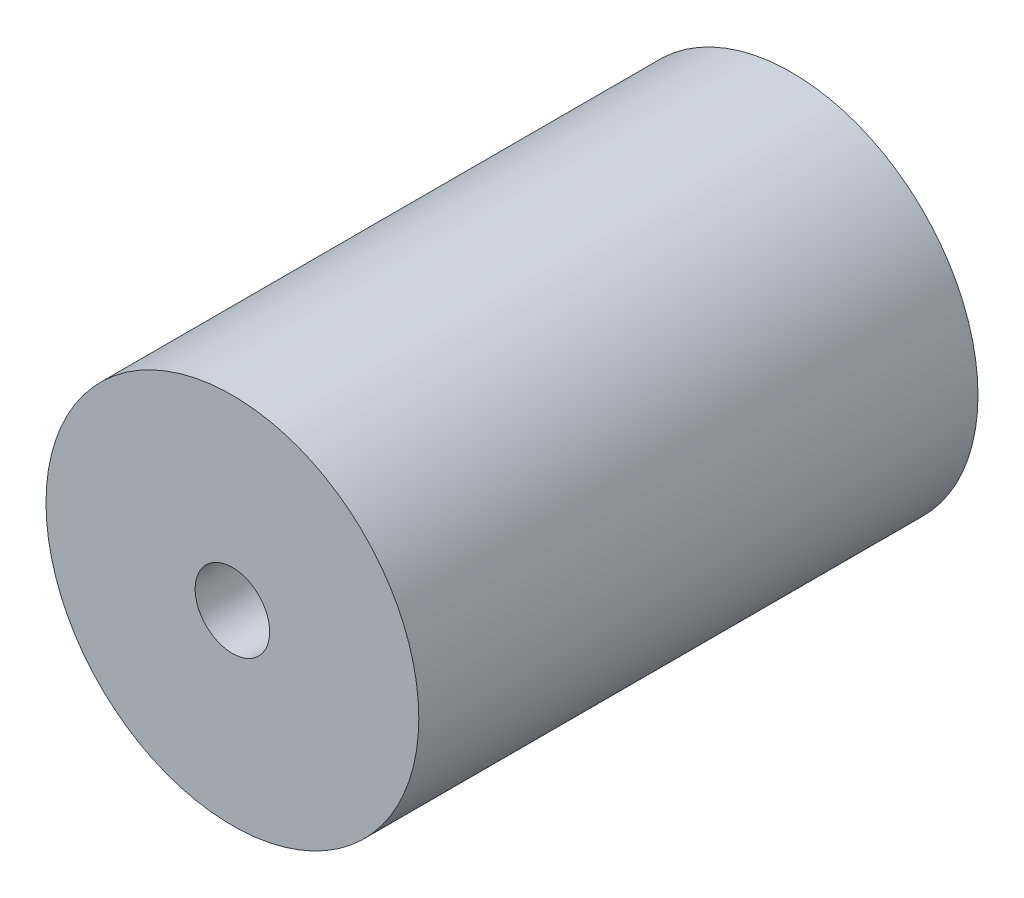
ISO-10303-21;
HEADER;
FILE_DESCRIPTION(('STEP AP214'),'2;1');
FILE_NAME('part.step','',(''),(''),'','','');
FILE_SCHEMA(('AUTOMOTIVE_DESIGN { 1 0 10303 214 1 1 1 1 }'));
ENDSEC;
DATA;
#1=APPLICATION_CONTEXT('core data for automotive mechanical design processes');
#2=APPLICATION_PROTOCOL_DEFINITION('international standard','automotive_design',2000,#1);
#3=PRODUCT_CONTEXT('',#1,'mechanical');
#4=PRODUCT('Part','Part','',(#3));
#5=PRODUCT_RELATED_PRODUCT_CATEGORY('part','',(#4));
#6=PRODUCT_DEFINITION_FORMATION('','',#4);
#7=PRODUCT_DEFINITION_CONTEXT('part definition',#1,'design');
#8=PRODUCT_DEFINITION('design','',#6,#7);
#9=PRODUCT_DEFINITION_SHAPE('','',#8);
#10=(LENGTH_UNIT() NAMED_UNIT(*) SI_UNIT(.MILLI.,.METRE.));
#11=(NAMED_UNIT(*) PLANE_ANGLE_UNIT() SI_UNIT($,.RADIAN.));
#12=(NAMED_UNIT(*) SI_UNIT($,.STERADIAN.) SOLID_ANGLE_UNIT());
#13=UNCERTAINTY_MEASURE_WITH_UNIT(LENGTH_MEASURE(1.E-05),#10,'distance_accuracy_value','');
#14=(GEOMETRIC_REPRESENTATION_CONTEXT(3) GLOBAL_UNCERTAINTY_ASSIGNED_CONTEXT((#13)) GLOBAL_UNIT_ASSIGNED_CONTEXT((#10,
#11,#12)) REPRESENTATION_CONTEXT('',''));
#15=CARTESIAN_POINT('',(0.,0.,0.));
#16=DIRECTION('',(0.,0.,1.));
#17=DIRECTION('',(1.,0.,0.));
#18=AXIS2_PLACEMENT_3D('',#15,#16,#17);
#19=CARTESIAN_POINT('',(0.,0.,-5.86898628384835));
#20=DIRECTION('',(0.,0.,1.));
#21=DIRECTION('',(1.,0.,0.));
#22=AXIS2_PLACEMENT_3D('',#19,#20,#21);
#23=CYLINDRICAL_SURFACE('',#22,2.075);
#24=CARTESIAN_POINT('',(0.,0.,24.5));
#25=DIRECTION('',(0.,0.,1.));
#26=DIRECTION('',(1.,0.,0.));
#27=AXIS2_PLACEMENT_3D('',#24,#25,#26);
#28=CIRCLE('',#27,2.075);
#29=CARTESIAN_POINT('',(2.075,0.,24.5));
#30=VERTEX_POINT('',#29);
#31=EDGE_CURVE('E10',#30,#30,#28,.T.);
#32=ORIENTED_EDGE('',*,*,#31,.T.);
#33=EDGE_LOOP('',(#32));
#34=FACE_BOUND('',#33,.T.);
#35=CARTESIAN_POINT('',(0.,0.,0.));
#36=DIRECTION('',(0.,0.,1.));
#37=DIRECTION('',(1.,0.,0.));
#38=AXIS2_PLACEMENT_3D('',#35,#36,#37);
#39=CIRCLE('',#38,2.075);
#40=CARTESIAN_POINT('',(2.075,0.,0.));
#41=VERTEX_POINT('',#40);
#42=EDGE_CURVE('E59',#41,#41,#39,.F.);
#43=ORIENTED_EDGE('',*,*,#42,.T.);
#44=EDGE_LOOP('',(#43));
#45=FACE_BOUND('',#44,.T.);
#46=ADVANCED_FACE('F39',(#34,#45),#23,.F.);
#47=CARTESIAN_POINT('',(0.,0.,60.));
#48=DIRECTION('',(0.,0.,-1.));
#49=DIRECTION('',(-1.,0.,0.));
#50=AXIS2_PLACEMENT_3D('',#47,#48,#49);
#51=CYLINDRICAL_SURFACE('',#50,20.);
#52=CARTESIAN_POINT('',(0.,0.,60.));
#53=DIRECTION('',(0.,0.,1.));
#54=DIRECTION('',(1.,0.,0.));
#55=AXIS2_PLACEMENT_3D('',#52,#53,#54);
#56=CIRCLE('',#55,20.);
#57=CARTESIAN_POINT('',(20.,0.,60.));
#58=VERTEX_POINT('',#57);
#59=EDGE_CURVE('E51',#58,#58,#56,.T.);
#60=ORIENTED_EDGE('',*,*,#59,.F.);
#61=EDGE_LOOP('',(#60));
#62=FACE_BOUND('',#61,.T.);
#63=CARTESIAN_POINT('',(0.,0.,0.));
#64=DIRECTION('',(0.,0.,1.));
#65=DIRECTION('',(1.,0.,0.));
#66=AXIS2_PLACEMENT_3D('',#63,#64,#65);
#67=CIRCLE('',#66,20.);
#68=CARTESIAN_POINT('',(20.,0.,0.));
#69=VERTEX_POINT('',#68);
#70=EDGE_CURVE('E55',#69,#69,#67,.T.);
#71=ORIENTED_EDGE('',*,*,#70,.T.);
#72=EDGE_LOOP('',(#71));
#73=FACE_BOUND('',#72,.T.);
#74=ADVANCED_FACE('F82',(#62,#73),#51,.T.);
#75=CARTESIAN_POINT('',(0.,0.,60.));
#76=DIRECTION('',(0.,0.,1.));
#77=DIRECTION('',(1.,0.,0.));
#78=AXIS2_PLACEMENT_3D('',#75,#76,#77);
#79=PLANE('',#78);
#80=CARTESIAN_POINT('',(0.,0.,60.));
#81=DIRECTION('',(0.,0.,1.));
#82=DIRECTION('',(1.,0.,0.));
#83=AXIS2_PLACEMENT_3D('',#80,#81,#82);
#84=CIRCLE('',#83,4.);
#85=CARTESIAN_POINT('',(4.,0.,60.));
#86=VERTEX_POINT('',#85);
#87=EDGE_CURVE('E64',#86,#86,#84,.T.);
#88=ORIENTED_EDGE('',*,*,#87,.F.);
#89=EDGE_LOOP('',(#88));
#90=FACE_BOUND('',#89,.T.);
#91=ORIENTED_EDGE('',*,*,#59,.T.);
#92=EDGE_LOOP('',(#91));
#93=FACE_BOUND('',#92,.T.);
#94=ADVANCED_FACE('F78',(#90,#93),#79,.T.);
#95=CARTESIAN_POINT('',(0.,0.,0.));
#96=DIRECTION('',(0.,0.,1.));
#97=DIRECTION('',(1.,0.,0.));
#98=AXIS2_PLACEMENT_3D('',#95,#96,#97);
#99=PLANE('',#98);
#100=ORIENTED_EDGE('',*,*,#42,.F.);
#101=EDGE_LOOP('',(#100));
#102=FACE_BOUND('',#101,.T.);
#103=ORIENTED_EDGE('',*,*,#70,.F.);
#104=EDGE_LOOP('',(#103));
#105=FACE_BOUND('',#104,.T.);
#106=ADVANCED_FACE('F81',(#102,#105),#99,.F.);
#107=CARTESIAN_POINT('',(0.,0.,25.));
#108=DIRECTION('',(0.,0.,1.));
#109=DIRECTION('',(1.,0.,0.));
#110=AXIS2_PLACEMENT_3D('',#107,#108,#109);
#111=PLANE('',#110);
#112=CARTESIAN_POINT('',(0.,0.,25.));
#113=DIRECTION('',(0.,0.,1.));
#114=DIRECTION('',(1.,0.,0.));
#115=AXIS2_PLACEMENT_3D('',#112,#113,#114);
#116=CIRCLE('',#115,2.57500000000001);
#117=CARTESIAN_POINT('',(2.57500000000001,0.,25.));
#118=VERTEX_POINT('',#117);
#119=EDGE_CURVE('E47',#118,#118,#116,.F.);
#120=ORIENTED_EDGE('',*,*,#119,.T.);
#121=EDGE_LOOP('',(#120));
#122=FACE_BOUND('',#121,.T.);
#123=CARTESIAN_POINT('',(0.,0.,25.));
#124=DIRECTION('',(0.,0.,1.));
#125=DIRECTION('',(1.,0.,0.));
#126=AXIS2_PLACEMENT_3D('',#123,#124,#125);
#127=CIRCLE('',#126,4.);
#128=CARTESIAN_POINT('',(4.,0.,25.));
#129=VERTEX_POINT('',#128);
#130=EDGE_CURVE('E63',#129,#129,#127,.T.);
#131=ORIENTED_EDGE('',*,*,#130,.T.);
#132=EDGE_LOOP('',(#131));
#133=FACE_BOUND('',#132,.T.);
#134=ADVANCED_FACE('F70',(#122,#133),#111,.T.);
#135=CARTESIAN_POINT('',(0.,0.,25.));
#136=DIRECTION('',(0.,0.,1.));
#137=DIRECTION('',(1.,0.,0.));
#138=AXIS2_PLACEMENT_3D('',#135,#136,#137);
#139=CYLINDRICAL_SURFACE('',#138,4.);
#140=ORIENTED_EDGE('',*,*,#130,.F.);
#141=EDGE_LOOP('',(#140));
#142=FACE_BOUND('',#141,.T.);
#143=ORIENTED_EDGE('',*,*,#87,.T.);
#144=EDGE_LOOP('',(#143));
#145=FACE_BOUND('',#144,.T.);
#146=ADVANCED_FACE('F72',(#142,#145),#139,.F.);
#147=CARTESIAN_POINT('',(0.,0.,25.));
#148=DIRECTION('',(0.,0.,1.));
#149=DIRECTION('',(1.,0.,0.));
#150=AXIS2_PLACEMENT_3D('',#147,#148,#149);
#151=CONICAL_SURFACE('',#150,2.57500000000001,0.785398163397449);
#152=ORIENTED_EDGE('',*,*,#31,.F.);
#153=EDGE_LOOP('',(#152));
#154=FACE_BOUND('',#153,.T.);
#155=ORIENTED_EDGE('',*,*,#119,.F.);
#156=EDGE_LOOP('',(#155));
#157=FACE_BOUND('',#156,.T.);
#158=ADVANCED_FACE('F42',(#154,#157),#151,.F.);
#159=CLOSED_SHELL('',(#46,#74,#94,#106,#134,#146,#158));
#160=MANIFOLD_SOLID_BREP('B2',#159);
#161=ADVANCED_BREP_SHAPE_REPRESENTATION('',(#18,#160),#14);
#162=SHAPE_DEFINITION_REPRESENTATION(#9,#161);
ENDSEC;
END-ISO-10303-21;
